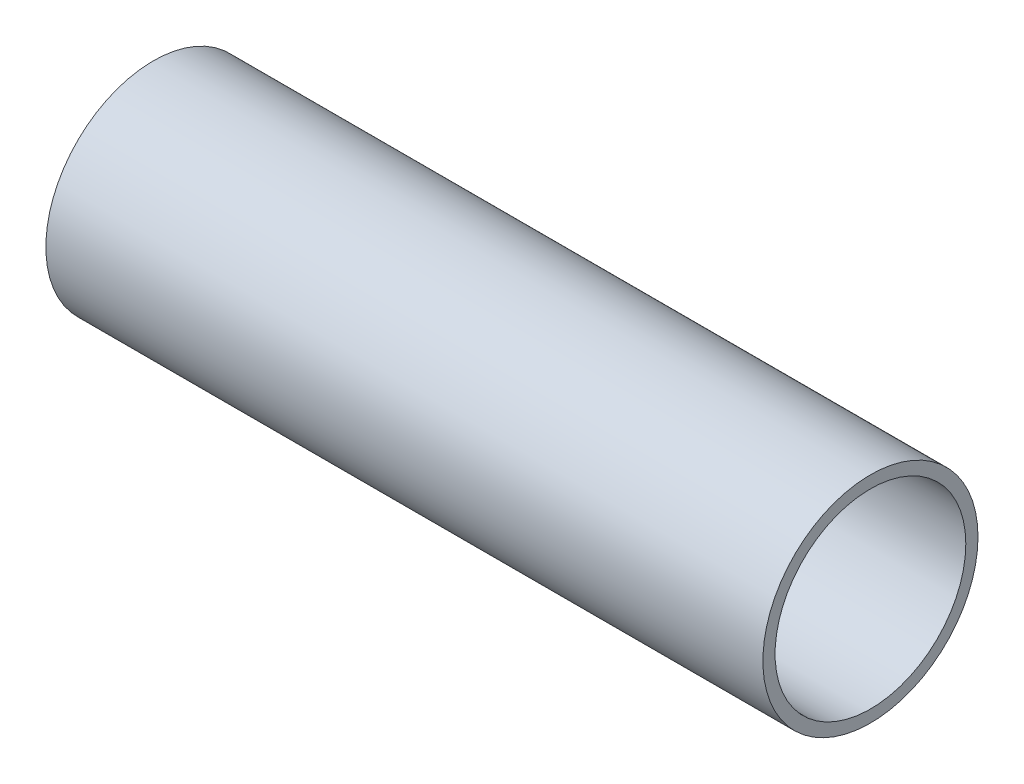
ISO-10303-21;
HEADER;
FILE_DESCRIPTION(('STEP AP214'),'2;1');
FILE_NAME('part.step','',(''),(''),'','','');
FILE_SCHEMA(('AUTOMOTIVE_DESIGN { 1 0 10303 214 1 1 1 1 }'));
ENDSEC;
DATA;
#1=APPLICATION_CONTEXT('core data for automotive mechanical design processes');
#2=APPLICATION_PROTOCOL_DEFINITION('international standard','automotive_design',2000,#1);
#3=PRODUCT_CONTEXT('',#1,'mechanical');
#4=PRODUCT('Part','Part','',(#3));
#5=PRODUCT_RELATED_PRODUCT_CATEGORY('part','',(#4));
#6=PRODUCT_DEFINITION_FORMATION('','',#4);
#7=PRODUCT_DEFINITION_CONTEXT('part definition',#1,'design');
#8=PRODUCT_DEFINITION('design','',#6,#7);
#9=PRODUCT_DEFINITION_SHAPE('','',#8);
#10=(LENGTH_UNIT() NAMED_UNIT(*) SI_UNIT(.MILLI.,.METRE.));
#11=(NAMED_UNIT(*) PLANE_ANGLE_UNIT() SI_UNIT($,.RADIAN.));
#12=(NAMED_UNIT(*) SI_UNIT($,.STERADIAN.) SOLID_ANGLE_UNIT());
#13=UNCERTAINTY_MEASURE_WITH_UNIT(LENGTH_MEASURE(1.E-05),#10,'distance_accuracy_value','');
#14=(GEOMETRIC_REPRESENTATION_CONTEXT(3) GLOBAL_UNCERTAINTY_ASSIGNED_CONTEXT((#13)) GLOBAL_UNIT_ASSIGNED_CONTEXT((#10,
#11,#12)) REPRESENTATION_CONTEXT('',''));
#15=CARTESIAN_POINT('',(0.,0.,0.));
#16=DIRECTION('',(0.,0.,1.));
#17=DIRECTION('',(1.,0.,0.));
#18=AXIS2_PLACEMENT_3D('',#15,#16,#17);
#19=CARTESIAN_POINT('',(100.,0.,0.));
#20=DIRECTION('',(1.,0.,0.));
#21=DIRECTION('',(0.,0.,-1.));
#22=AXIS2_PLACEMENT_3D('',#19,#20,#21);
#23=PLANE('',#22);
#24=CARTESIAN_POINT('',(100.,0.,0.));
#25=DIRECTION('',(1.,0.,0.));
#26=DIRECTION('',(0.,0.,-1.));
#27=AXIS2_PLACEMENT_3D('',#24,#25,#26);
#28=CIRCLE('',#27,15.);
#29=CARTESIAN_POINT('',(100.,0.,-15.));
#30=VERTEX_POINT('',#29);
#31=EDGE_CURVE('E10',#30,#30,#28,.T.);
#32=ORIENTED_EDGE('',*,*,#31,.T.);
#33=EDGE_LOOP('',(#32));
#34=FACE_BOUND('',#33,.T.);
#35=CARTESIAN_POINT('',(100.,0.,0.));
#36=DIRECTION('',(1.,0.,0.));
#37=DIRECTION('',(0.,0.,-1.));
#38=AXIS2_PLACEMENT_3D('',#35,#36,#37);
#39=CIRCLE('',#38,13.3);
#40=CARTESIAN_POINT('',(100.,0.,-13.3));
#41=VERTEX_POINT('',#40);
#42=EDGE_CURVE('E43',#41,#41,#39,.T.);
#43=ORIENTED_EDGE('',*,*,#42,.F.);
#44=EDGE_LOOP('',(#43));
#45=FACE_BOUND('',#44,.T.);
#46=ADVANCED_FACE('F32',(#34,#45),#23,.T.);
#47=CARTESIAN_POINT('',(0.,0.,0.));
#48=DIRECTION('',(1.,0.,0.));
#49=DIRECTION('',(0.,0.,-1.));
#50=AXIS2_PLACEMENT_3D('',#47,#48,#49);
#51=PLANE('',#50);
#52=CARTESIAN_POINT('',(0.,0.,0.));
#53=DIRECTION('',(1.,0.,0.));
#54=DIRECTION('',(0.,0.,-1.));
#55=AXIS2_PLACEMENT_3D('',#52,#53,#54);
#56=CIRCLE('',#55,15.);
#57=CARTESIAN_POINT('',(0.,0.,-15.));
#58=VERTEX_POINT('',#57);
#59=EDGE_CURVE('E36',#58,#58,#56,.T.);
#60=ORIENTED_EDGE('',*,*,#59,.F.);
#61=EDGE_LOOP('',(#60));
#62=FACE_BOUND('',#61,.T.);
#63=CARTESIAN_POINT('',(0.,0.,0.));
#64=DIRECTION('',(1.,0.,0.));
#65=DIRECTION('',(0.,0.,-1.));
#66=AXIS2_PLACEMENT_3D('',#63,#64,#65);
#67=CIRCLE('',#66,13.3);
#68=CARTESIAN_POINT('',(0.,0.,-13.3));
#69=VERTEX_POINT('',#68);
#70=EDGE_CURVE('E45',#69,#69,#67,.T.);
#71=ORIENTED_EDGE('',*,*,#70,.T.);
#72=EDGE_LOOP('',(#71));
#73=FACE_BOUND('',#72,.T.);
#74=ADVANCED_FACE('F55',(#62,#73),#51,.F.);
#75=CARTESIAN_POINT('',(100.,0.,0.));
#76=DIRECTION('',(-1.,0.,0.));
#77=DIRECTION('',(0.,0.,1.));
#78=AXIS2_PLACEMENT_3D('',#75,#76,#77);
#79=CYLINDRICAL_SURFACE('',#78,15.);
#80=ORIENTED_EDGE('',*,*,#31,.F.);
#81=EDGE_LOOP('',(#80));
#82=FACE_BOUND('',#81,.T.);
#83=ORIENTED_EDGE('',*,*,#59,.T.);
#84=EDGE_LOOP('',(#83));
#85=FACE_BOUND('',#84,.T.);
#86=ADVANCED_FACE('F34',(#82,#85),#79,.T.);
#87=CARTESIAN_POINT('',(100.,0.,0.));
#88=DIRECTION('',(-1.,0.,0.));
#89=DIRECTION('',(0.,0.,1.));
#90=AXIS2_PLACEMENT_3D('',#87,#88,#89);
#91=CYLINDRICAL_SURFACE('',#90,13.3);
#92=ORIENTED_EDGE('',*,*,#42,.T.);
#93=EDGE_LOOP('',(#92));
#94=FACE_BOUND('',#93,.T.);
#95=ORIENTED_EDGE('',*,*,#70,.F.);
#96=EDGE_LOOP('',(#95));
#97=FACE_BOUND('',#96,.T.);
#98=ADVANCED_FACE('F51',(#94,#97),#91,.F.);
#99=CLOSED_SHELL('',(#46,#74,#86,#98));
#100=MANIFOLD_SOLID_BREP('B2',#99);
#101=ADVANCED_BREP_SHAPE_REPRESENTATION('',(#18,#100),#14);
#102=SHAPE_DEFINITION_REPRESENTATION(#9,#101);
ENDSEC;
END-ISO-10303-21;
